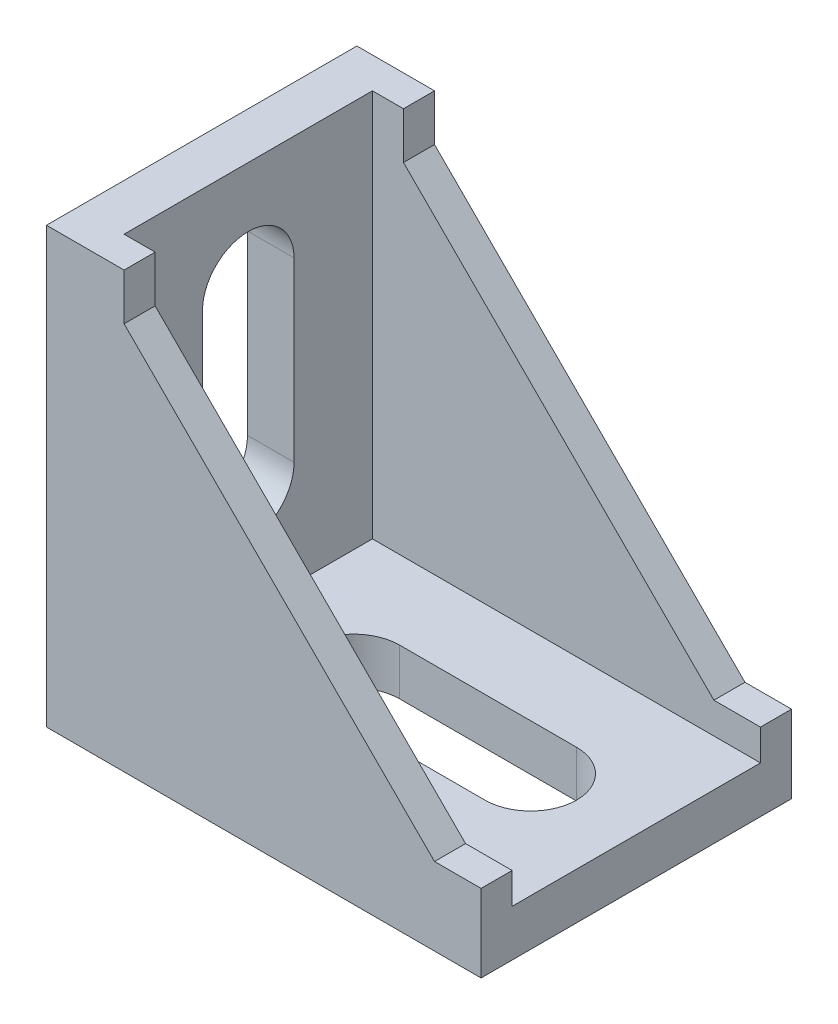
ISO-10303-21;
HEADER;
FILE_DESCRIPTION(('STEP AP214'),'2;1');
FILE_NAME('part.step','',(''),(''),'','','');
FILE_SCHEMA(('AUTOMOTIVE_DESIGN { 1 0 10303 214 1 1 1 1 }'));
ENDSEC;
DATA;
#1=APPLICATION_CONTEXT('core data for automotive mechanical design processes');
#2=APPLICATION_PROTOCOL_DEFINITION('international standard','automotive_design',2000,#1);
#3=PRODUCT_CONTEXT('',#1,'mechanical');
#4=PRODUCT('Part','Part','',(#3));
#5=PRODUCT_RELATED_PRODUCT_CATEGORY('part','',(#4));
#6=PRODUCT_DEFINITION_FORMATION('','',#4);
#7=PRODUCT_DEFINITION_CONTEXT('part definition',#1,'design');
#8=PRODUCT_DEFINITION('design','',#6,#7);
#9=PRODUCT_DEFINITION_SHAPE('','',#8);
#10=(LENGTH_UNIT() NAMED_UNIT(*) SI_UNIT(.MILLI.,.METRE.));
#11=(NAMED_UNIT(*) PLANE_ANGLE_UNIT() SI_UNIT($,.RADIAN.));
#12=(NAMED_UNIT(*) SI_UNIT($,.STERADIAN.) SOLID_ANGLE_UNIT());
#13=UNCERTAINTY_MEASURE_WITH_UNIT(LENGTH_MEASURE(1.E-05),#10,'distance_accuracy_value','');
#14=(GEOMETRIC_REPRESENTATION_CONTEXT(3) GLOBAL_UNCERTAINTY_ASSIGNED_CONTEXT((#13)) GLOBAL_UNIT_ASSIGNED_CONTEXT((#10,
#11,#12)) REPRESENTATION_CONTEXT('',''));
#15=CARTESIAN_POINT('',(0.,0.,0.));
#16=DIRECTION('',(0.,0.,1.));
#17=DIRECTION('',(1.,0.,0.));
#18=AXIS2_PLACEMENT_3D('',#15,#16,#17);
#19=CARTESIAN_POINT('',(3.,28.,-20.));
#20=DIRECTION('',(1.,0.,0.));
#21=DIRECTION('',(0.,1.,0.));
#22=AXIS2_PLACEMENT_3D('',#19,#20,#21);
#23=PLANE('',#22);
#24=CARTESIAN_POINT('',(3.,21.2,-10.));
#25=DIRECTION('',(1.,0.,0.));
#26=DIRECTION('',(0.,1.,0.));
#27=AXIS2_PLACEMENT_3D('',#24,#25,#26);
#28=CIRCLE('',#27,2.95);
#29=CARTESIAN_POINT('',(3.,21.2,-12.95));
#30=VERTEX_POINT('',#29);
#31=CARTESIAN_POINT('',(3.,21.2,-7.05));
#32=VERTEX_POINT('',#31);
#33=EDGE_CURVE('E271',#30,#32,#28,.T.);
#34=ORIENTED_EDGE('',*,*,#33,.F.);
#35=DIRECTION('',(0.,1.,0.));
#36=VECTOR('',#35,1.);
#37=CARTESIAN_POINT('',(3.,21.2,-12.95));
#38=LINE('',#37,#36);
#39=CARTESIAN_POINT('',(3.,9.8,-12.95));
#40=VERTEX_POINT('',#39);
#41=EDGE_CURVE('E285',#40,#30,#38,.T.);
#42=ORIENTED_EDGE('',*,*,#41,.F.);
#43=CARTESIAN_POINT('',(3.,9.8,-10.));
#44=DIRECTION('',(1.,0.,0.));
#45=DIRECTION('',(0.,1.,0.));
#46=AXIS2_PLACEMENT_3D('',#43,#44,#45);
#47=CIRCLE('',#46,2.95);
#48=CARTESIAN_POINT('',(3.,9.8,-7.05));
#49=VERTEX_POINT('',#48);
#50=EDGE_CURVE('E282',#49,#40,#47,.T.);
#51=ORIENTED_EDGE('',*,*,#50,.F.);
#52=DIRECTION('',(0.,-1.,0.));
#53=VECTOR('',#52,1.);
#54=CARTESIAN_POINT('',(3.,21.2,-7.05));
#55=LINE('',#54,#53);
#56=EDGE_CURVE('E279',#32,#49,#55,.T.);
#57=ORIENTED_EDGE('',*,*,#56,.F.);
#58=EDGE_LOOP('',(#34,#42,#51,#57));
#59=FACE_BOUND('',#58,.T.);
#60=DIRECTION('',(0.,0.,1.));
#61=VECTOR('',#60,1.);
#62=CARTESIAN_POINT('',(3.,3.,-20.));
#63=LINE('',#62,#61);
#64=CARTESIAN_POINT('',(3.,3.,-18.));
#65=VERTEX_POINT('',#64);
#66=CARTESIAN_POINT('',(3.,3.,-2.));
#67=VERTEX_POINT('',#66);
#68=EDGE_CURVE('E358',#65,#67,#63,.T.);
#69=ORIENTED_EDGE('',*,*,#68,.F.);
#70=DIRECTION('',(0.,-1.,0.));
#71=VECTOR('',#70,1.);
#72=CARTESIAN_POINT('',(3.,28.,-18.));
#73=LINE('',#72,#71);
#74=CARTESIAN_POINT('',(3.,28.,-18.));
#75=VERTEX_POINT('',#74);
#76=EDGE_CURVE('E67',#75,#65,#73,.T.);
#77=ORIENTED_EDGE('',*,*,#76,.F.);
#78=DIRECTION('',(0.,0.,1.));
#79=VECTOR('',#78,1.);
#80=CARTESIAN_POINT('',(3.,28.,-20.));
#81=LINE('',#80,#79);
#82=CARTESIAN_POINT('',(3.,28.,-2.));
#83=VERTEX_POINT('',#82);
#84=EDGE_CURVE('E216',#75,#83,#81,.T.);
#85=ORIENTED_EDGE('',*,*,#84,.T.);
#86=DIRECTION('',(0.,-1.,0.));
#87=VECTOR('',#86,1.);
#88=CARTESIAN_POINT('',(3.,28.,-2.));
#89=LINE('',#88,#87);
#90=EDGE_CURVE('E239',#83,#67,#89,.T.);
#91=ORIENTED_EDGE('',*,*,#90,.T.);
#92=EDGE_LOOP('',(#69,#77,#85,#91));
#93=FACE_BOUND('',#92,.T.);
#94=ADVANCED_FACE('F43',(#59,#93),#23,.T.);
#95=CARTESIAN_POINT('',(3.,3.,-20.));
#96=DIRECTION('',(0.,1.,0.));
#97=DIRECTION('',(-1.,0.,0.));
#98=AXIS2_PLACEMENT_3D('',#95,#96,#97);
#99=PLANE('',#98);
#100=CARTESIAN_POINT('',(9.8,3.,-10.));
#101=DIRECTION('',(0.,1.,0.));
#102=DIRECTION('',(-1.,0.,0.));
#103=AXIS2_PLACEMENT_3D('',#100,#101,#102);
#104=CIRCLE('',#103,2.95);
#105=CARTESIAN_POINT('',(9.8,3.,-12.95));
#106=VERTEX_POINT('',#105);
#107=CARTESIAN_POINT('',(9.8,3.,-7.05));
#108=VERTEX_POINT('',#107);
#109=EDGE_CURVE('E306',#106,#108,#104,.T.);
#110=ORIENTED_EDGE('',*,*,#109,.F.);
#111=DIRECTION('',(-1.,0.,0.));
#112=VECTOR('',#111,1.);
#113=CARTESIAN_POINT('',(9.8,3.,-12.95));
#114=LINE('',#113,#112);
#115=CARTESIAN_POINT('',(21.2,3.,-12.95));
#116=VERTEX_POINT('',#115);
#117=EDGE_CURVE('E314',#116,#106,#114,.T.);
#118=ORIENTED_EDGE('',*,*,#117,.F.);
#119=CARTESIAN_POINT('',(21.2,3.,-10.));
#120=DIRECTION('',(0.,1.,0.));
#121=DIRECTION('',(-1.,0.,0.));
#122=AXIS2_PLACEMENT_3D('',#119,#120,#121);
#123=CIRCLE('',#122,2.95);
#124=CARTESIAN_POINT('',(21.2,3.,-7.05));
#125=VERTEX_POINT('',#124);
#126=EDGE_CURVE('E311',#125,#116,#123,.T.);
#127=ORIENTED_EDGE('',*,*,#126,.F.);
#128=DIRECTION('',(1.,0.,0.));
#129=VECTOR('',#128,1.);
#130=CARTESIAN_POINT('',(9.8,3.,-7.05));
#131=LINE('',#130,#129);
#132=EDGE_CURVE('E308',#108,#125,#131,.T.);
#133=ORIENTED_EDGE('',*,*,#132,.F.);
#134=EDGE_LOOP('',(#110,#118,#127,#133));
#135=FACE_BOUND('',#134,.T.);
#136=DIRECTION('',(0.,0.,1.));
#137=VECTOR('',#136,1.);
#138=CARTESIAN_POINT('',(28.,3.,-20.));
#139=LINE('',#138,#137);
#140=CARTESIAN_POINT('',(28.,3.,-18.));
#141=VERTEX_POINT('',#140);
#142=CARTESIAN_POINT('',(28.,3.,-2.));
#143=VERTEX_POINT('',#142);
#144=EDGE_CURVE('E359',#141,#143,#139,.T.);
#145=ORIENTED_EDGE('',*,*,#144,.F.);
#146=DIRECTION('',(1.,0.,0.));
#147=VECTOR('',#146,1.);
#148=CARTESIAN_POINT('',(3.,3.,-18.));
#149=LINE('',#148,#147);
#150=EDGE_CURVE('E60',#65,#141,#149,.T.);
#151=ORIENTED_EDGE('',*,*,#150,.F.);
#152=ORIENTED_EDGE('',*,*,#68,.T.);
#153=DIRECTION('',(1.,0.,0.));
#154=VECTOR('',#153,1.);
#155=CARTESIAN_POINT('',(3.,3.,-2.));
#156=LINE('',#155,#154);
#157=EDGE_CURVE('E242',#67,#143,#156,.T.);
#158=ORIENTED_EDGE('',*,*,#157,.T.);
#159=EDGE_LOOP('',(#145,#151,#152,#158));
#160=FACE_BOUND('',#159,.T.);
#161=ADVANCED_FACE('F401',(#135,#160),#99,.T.);
#162=CARTESIAN_POINT('',(28.,0.,-20.));
#163=DIRECTION('',(0.,-1.,0.));
#164=DIRECTION('',(1.,0.,0.));
#165=AXIS2_PLACEMENT_3D('',#162,#163,#164);
#166=PLANE('',#165);
#167=CARTESIAN_POINT('',(9.8,0.,-10.));
#168=DIRECTION('',(0.,-1.,0.));
#169=DIRECTION('',(1.,0.,0.));
#170=AXIS2_PLACEMENT_3D('',#167,#168,#169);
#171=CIRCLE('',#170,2.95);
#172=CARTESIAN_POINT('',(9.8,0.,-7.05));
#173=VERTEX_POINT('',#172);
#174=CARTESIAN_POINT('',(9.8,0.,-12.95));
#175=VERTEX_POINT('',#174);
#176=EDGE_CURVE('E333',#173,#175,#171,.T.);
#177=ORIENTED_EDGE('',*,*,#176,.F.);
#178=DIRECTION('',(-1.,0.,0.));
#179=VECTOR('',#178,1.);
#180=CARTESIAN_POINT('',(28.,0.,-7.05000000000001));
#181=LINE('',#180,#179);
#182=CARTESIAN_POINT('',(21.2,0.,-7.05000000000001));
#183=VERTEX_POINT('',#182);
#184=EDGE_CURVE('E320',#183,#173,#181,.T.);
#185=ORIENTED_EDGE('',*,*,#184,.F.);
#186=CARTESIAN_POINT('',(21.2,0.,-10.));
#187=DIRECTION('',(0.,-1.,0.));
#188=DIRECTION('',(1.,0.,0.));
#189=AXIS2_PLACEMENT_3D('',#186,#187,#188);
#190=CIRCLE('',#189,2.95);
#191=CARTESIAN_POINT('',(21.2,0.,-12.95));
#192=VERTEX_POINT('',#191);
#193=EDGE_CURVE('E328',#192,#183,#190,.T.);
#194=ORIENTED_EDGE('',*,*,#193,.F.);
#195=DIRECTION('',(1.,0.,0.));
#196=VECTOR('',#195,1.);
#197=CARTESIAN_POINT('',(28.,0.,-12.95));
#198=LINE('',#197,#196);
#199=EDGE_CURVE('E331',#175,#192,#198,.T.);
#200=ORIENTED_EDGE('',*,*,#199,.F.);
#201=EDGE_LOOP('',(#177,#185,#194,#200));
#202=FACE_BOUND('',#201,.T.);
#203=DIRECTION('',(1.,0.,0.));
#204=VECTOR('',#203,1.);
#205=CARTESIAN_POINT('',(28.,0.,0.));
#206=LINE('',#205,#204);
#207=CARTESIAN_POINT('',(0.,0.,0.));
#208=VERTEX_POINT('',#207);
#209=CARTESIAN_POINT('',(28.,0.,0.));
#210=VERTEX_POINT('',#209);
#211=EDGE_CURVE('E335',#208,#210,#206,.T.);
#212=ORIENTED_EDGE('',*,*,#211,.F.);
#213=DIRECTION('',(0.,0.,1.));
#214=VECTOR('',#213,1.);
#215=CARTESIAN_POINT('',(0.,0.,-20.));
#216=LINE('',#215,#214);
#217=CARTESIAN_POINT('',(0.,0.,-20.));
#218=VERTEX_POINT('',#217);
#219=EDGE_CURVE('E11',#218,#208,#216,.T.);
#220=ORIENTED_EDGE('',*,*,#219,.F.);
#221=DIRECTION('',(1.,0.,0.));
#222=VECTOR('',#221,1.);
#223=CARTESIAN_POINT('',(28.,0.,-20.));
#224=LINE('',#223,#222);
#225=CARTESIAN_POINT('',(28.,0.,-20.));
#226=VERTEX_POINT('',#225);
#227=EDGE_CURVE('E336',#218,#226,#224,.T.);
#228=ORIENTED_EDGE('',*,*,#227,.T.);
#229=DIRECTION('',(0.,0.,1.));
#230=VECTOR('',#229,1.);
#231=CARTESIAN_POINT('',(28.,0.,-20.));
#232=LINE('',#231,#230);
#233=EDGE_CURVE('E47',#226,#210,#232,.T.);
#234=ORIENTED_EDGE('',*,*,#233,.T.);
#235=EDGE_LOOP('',(#212,#220,#228,#234));
#236=FACE_BOUND('',#235,.T.);
#237=ADVANCED_FACE('F45',(#202,#236),#166,.T.);
#238=CARTESIAN_POINT('',(0.,0.,-20.));
#239=DIRECTION('',(-1.,0.,0.));
#240=DIRECTION('',(0.,0.,1.));
#241=AXIS2_PLACEMENT_3D('',#238,#239,#240);
#242=PLANE('',#241);
#243=CARTESIAN_POINT('',(0.,21.2,-10.));
#244=DIRECTION('',(-1.,0.,0.));
#245=DIRECTION('',(0.,0.,1.));
#246=AXIS2_PLACEMENT_3D('',#243,#244,#245);
#247=CIRCLE('',#246,2.95);
#248=CARTESIAN_POINT('',(0.,21.2,-7.05));
#249=VERTEX_POINT('',#248);
#250=CARTESIAN_POINT('',(0.,21.2,-12.95));
#251=VERTEX_POINT('',#250);
#252=EDGE_CURVE('E304',#249,#251,#247,.T.);
#253=ORIENTED_EDGE('',*,*,#252,.F.);
#254=DIRECTION('',(0.,1.,0.));
#255=VECTOR('',#254,1.);
#256=CARTESIAN_POINT('',(0.,0.,-7.05));
#257=LINE('',#256,#255);
#258=CARTESIAN_POINT('',(0.,9.8,-7.05));
#259=VERTEX_POINT('',#258);
#260=EDGE_CURVE('E291',#259,#249,#257,.T.);
#261=ORIENTED_EDGE('',*,*,#260,.F.);
#262=CARTESIAN_POINT('',(0.,9.8,-10.));
#263=DIRECTION('',(-1.,0.,0.));
#264=DIRECTION('',(0.,0.,1.));
#265=AXIS2_PLACEMENT_3D('',#262,#263,#264);
#266=CIRCLE('',#265,2.95);
#267=CARTESIAN_POINT('',(0.,9.8,-12.95));
#268=VERTEX_POINT('',#267);
#269=EDGE_CURVE('E299',#268,#259,#266,.T.);
#270=ORIENTED_EDGE('',*,*,#269,.F.);
#271=DIRECTION('',(0.,-1.,0.));
#272=VECTOR('',#271,1.);
#273=CARTESIAN_POINT('',(0.,0.,-12.95));
#274=LINE('',#273,#272);
#275=EDGE_CURVE('E302',#251,#268,#274,.T.);
#276=ORIENTED_EDGE('',*,*,#275,.F.);
#277=EDGE_LOOP('',(#253,#261,#270,#276));
#278=FACE_BOUND('',#277,.T.);
#279=DIRECTION('',(0.,-1.,0.));
#280=VECTOR('',#279,1.);
#281=CARTESIAN_POINT('',(0.,0.,0.));
#282=LINE('',#281,#280);
#283=CARTESIAN_POINT('',(0.,28.,0.));
#284=VERTEX_POINT('',#283);
#285=EDGE_CURVE('E340',#284,#208,#282,.T.);
#286=ORIENTED_EDGE('',*,*,#285,.F.);
#287=DIRECTION('',(0.,0.,1.));
#288=VECTOR('',#287,1.);
#289=CARTESIAN_POINT('',(0.,28.,-20.));
#290=LINE('',#289,#288);
#291=CARTESIAN_POINT('',(0.,28.,-20.));
#292=VERTEX_POINT('',#291);
#293=EDGE_CURVE('E52',#292,#284,#290,.T.);
#294=ORIENTED_EDGE('',*,*,#293,.F.);
#295=DIRECTION('',(0.,-1.,0.));
#296=VECTOR('',#295,1.);
#297=CARTESIAN_POINT('',(0.,0.,-20.));
#298=LINE('',#297,#296);
#299=EDGE_CURVE('E344',#292,#218,#298,.T.);
#300=ORIENTED_EDGE('',*,*,#299,.T.);
#301=ORIENTED_EDGE('',*,*,#219,.T.);
#302=EDGE_LOOP('',(#286,#294,#300,#301));
#303=FACE_BOUND('',#302,.T.);
#304=ADVANCED_FACE('F374',(#278,#303),#242,.T.);
#305=CARTESIAN_POINT('',(0.,28.,-20.));
#306=DIRECTION('',(0.,1.,0.));
#307=DIRECTION('',(0.,0.,1.));
#308=AXIS2_PLACEMENT_3D('',#305,#306,#307);
#309=PLANE('',#308);
#310=DIRECTION('',(-1.,0.,0.));
#311=VECTOR('',#310,1.);
#312=CARTESIAN_POINT('',(0.,28.,0.));
#313=LINE('',#312,#311);
#314=CARTESIAN_POINT('',(5.,28.,0.));
#315=VERTEX_POINT('',#314);
#316=EDGE_CURVE('E351',#315,#284,#313,.T.);
#317=ORIENTED_EDGE('',*,*,#316,.F.);
#318=DIRECTION('',(0.,0.,1.));
#319=VECTOR('',#318,1.);
#320=CARTESIAN_POINT('',(5.,28.,-2.));
#321=LINE('',#320,#319);
#322=CARTESIAN_POINT('',(5.,28.,-2.));
#323=VERTEX_POINT('',#322);
#324=EDGE_CURVE('E268',#323,#315,#321,.T.);
#325=ORIENTED_EDGE('',*,*,#324,.F.);
#326=DIRECTION('',(-1.,0.,0.));
#327=VECTOR('',#326,1.);
#328=CARTESIAN_POINT('',(3.,28.,-2.));
#329=LINE('',#328,#327);
#330=EDGE_CURVE('E258',#323,#83,#329,.T.);
#331=ORIENTED_EDGE('',*,*,#330,.T.);
#332=ORIENTED_EDGE('',*,*,#84,.F.);
#333=DIRECTION('',(-1.,0.,0.));
#334=VECTOR('',#333,1.);
#335=CARTESIAN_POINT('',(3.,28.,-18.));
#336=LINE('',#335,#334);
#337=CARTESIAN_POINT('',(5.,28.,-18.));
#338=VERTEX_POINT('',#337);
#339=EDGE_CURVE('E197',#338,#75,#336,.T.);
#340=ORIENTED_EDGE('',*,*,#339,.F.);
#341=DIRECTION('',(0.,0.,-1.));
#342=VECTOR('',#341,1.);
#343=CARTESIAN_POINT('',(5.,28.,-18.));
#344=LINE('',#343,#342);
#345=CARTESIAN_POINT('',(5.,28.,-20.));
#346=VERTEX_POINT('',#345);
#347=EDGE_CURVE('E206',#338,#346,#344,.T.);
#348=ORIENTED_EDGE('',*,*,#347,.T.);
#349=DIRECTION('',(-1.,0.,0.));
#350=VECTOR('',#349,1.);
#351=CARTESIAN_POINT('',(0.,28.,-20.));
#352=LINE('',#351,#350);
#353=EDGE_CURVE('E342',#346,#292,#352,.T.);
#354=ORIENTED_EDGE('',*,*,#353,.T.);
#355=ORIENTED_EDGE('',*,*,#293,.T.);
#356=EDGE_LOOP('',(#317,#325,#331,#332,#340,#348,#354,#355));
#357=FACE_BOUND('',#356,.T.);
#358=ADVANCED_FACE('F214',(#357),#309,.T.);
#359=CARTESIAN_POINT('',(28.,3.,-20.));
#360=DIRECTION('',(1.,0.,0.));
#361=DIRECTION('',(0.,0.,-1.));
#362=AXIS2_PLACEMENT_3D('',#359,#360,#361);
#363=PLANE('',#362);
#364=DIRECTION('',(0.,1.,0.));
#365=VECTOR('',#364,1.);
#366=CARTESIAN_POINT('',(28.,3.,0.));
#367=LINE('',#366,#365);
#368=CARTESIAN_POINT('',(28.,5.,0.));
#369=VERTEX_POINT('',#368);
#370=EDGE_CURVE('E349',#210,#369,#367,.T.);
#371=ORIENTED_EDGE('',*,*,#370,.F.);
#372=ORIENTED_EDGE('',*,*,#233,.F.);
#373=DIRECTION('',(0.,1.,0.));
#374=VECTOR('',#373,1.);
#375=CARTESIAN_POINT('',(28.,3.,-20.));
#376=LINE('',#375,#374);
#377=CARTESIAN_POINT('',(28.,5.,-20.));
#378=VERTEX_POINT('',#377);
#379=EDGE_CURVE('E339',#226,#378,#376,.T.);
#380=ORIENTED_EDGE('',*,*,#379,.T.);
#381=DIRECTION('',(0.,0.,-1.));
#382=VECTOR('',#381,1.);
#383=CARTESIAN_POINT('',(28.,5.,-18.));
#384=LINE('',#383,#382);
#385=CARTESIAN_POINT('',(28.,5.,-18.));
#386=VERTEX_POINT('',#385);
#387=EDGE_CURVE('E231',#386,#378,#384,.T.);
#388=ORIENTED_EDGE('',*,*,#387,.F.);
#389=DIRECTION('',(0.,1.,0.));
#390=VECTOR('',#389,1.);
#391=CARTESIAN_POINT('',(28.,5.,-18.));
#392=LINE('',#391,#390);
#393=EDGE_CURVE('E224',#141,#386,#392,.T.);
#394=ORIENTED_EDGE('',*,*,#393,.F.);
#395=ORIENTED_EDGE('',*,*,#144,.T.);
#396=DIRECTION('',(0.,1.,0.));
#397=VECTOR('',#396,1.);
#398=CARTESIAN_POINT('',(28.,5.,-2.));
#399=LINE('',#398,#397);
#400=CARTESIAN_POINT('',(28.,5.,-2.));
#401=VERTEX_POINT('',#400);
#402=EDGE_CURVE('E246',#143,#401,#399,.T.);
#403=ORIENTED_EDGE('',*,*,#402,.T.);
#404=DIRECTION('',(0.,0.,1.));
#405=VECTOR('',#404,1.);
#406=CARTESIAN_POINT('',(28.,5.,-2.));
#407=LINE('',#406,#405);
#408=EDGE_CURVE('E260',#401,#369,#407,.T.);
#409=ORIENTED_EDGE('',*,*,#408,.T.);
#410=EDGE_LOOP('',(#371,#372,#380,#388,#394,#395,#403,#409));
#411=FACE_BOUND('',#410,.T.);
#412=ADVANCED_FACE('F368',(#411),#363,.T.);
#413=CARTESIAN_POINT('',(0.,0.,-20.));
#414=DIRECTION('',(0.,0.,-1.));
#415=DIRECTION('',(-1.,0.,0.));
#416=AXIS2_PLACEMENT_3D('',#413,#414,#415);
#417=PLANE('',#416);
#418=ORIENTED_EDGE('',*,*,#353,.F.);
#419=DIRECTION('',(0.,1.,0.));
#420=VECTOR('',#419,1.);
#421=CARTESIAN_POINT('',(5.,28.,-20.));
#422=LINE('',#421,#420);
#423=CARTESIAN_POINT('',(5.,24.9999999999999,-20.));
#424=VERTEX_POINT('',#423);
#425=EDGE_CURVE('E209',#424,#346,#422,.T.);
#426=ORIENTED_EDGE('',*,*,#425,.F.);
#427=DIRECTION('',(-0.707106781186549,0.707106781186546,0.));
#428=VECTOR('',#427,1.);
#429=CARTESIAN_POINT('',(5.,24.9999999999999,-20.));
#430=LINE('',#429,#428);
#431=CARTESIAN_POINT('',(25.,5.,-20.));
#432=VERTEX_POINT('',#431);
#433=EDGE_CURVE('E228',#432,#424,#430,.T.);
#434=ORIENTED_EDGE('',*,*,#433,.F.);
#435=DIRECTION('',(-1.,0.,0.));
#436=VECTOR('',#435,1.);
#437=CARTESIAN_POINT('',(25.,5.,-20.));
#438=LINE('',#437,#436);
#439=EDGE_CURVE('E218',#378,#432,#438,.T.);
#440=ORIENTED_EDGE('',*,*,#439,.F.);
#441=ORIENTED_EDGE('',*,*,#379,.F.);
#442=ORIENTED_EDGE('',*,*,#227,.F.);
#443=ORIENTED_EDGE('',*,*,#299,.F.);
#444=EDGE_LOOP('',(#418,#426,#434,#440,#441,#442,#443));
#445=FACE_BOUND('',#444,.T.);
#446=ADVANCED_FACE('F377',(#445),#417,.T.);
#447=CARTESIAN_POINT('',(0.,0.,0.));
#448=DIRECTION('',(0.,0.,-1.));
#449=DIRECTION('',(-1.,0.,0.));
#450=AXIS2_PLACEMENT_3D('',#447,#448,#449);
#451=PLANE('',#450);
#452=DIRECTION('',(0.,1.,0.));
#453=VECTOR('',#452,1.);
#454=CARTESIAN_POINT('',(5.,28.,0.));
#455=LINE('',#454,#453);
#456=CARTESIAN_POINT('',(5.,24.9999999999999,0.));
#457=VERTEX_POINT('',#456);
#458=EDGE_CURVE('E243',#457,#315,#455,.T.);
#459=ORIENTED_EDGE('',*,*,#458,.T.);
#460=ORIENTED_EDGE('',*,*,#316,.T.);
#461=ORIENTED_EDGE('',*,*,#285,.T.);
#462=ORIENTED_EDGE('',*,*,#211,.T.);
#463=ORIENTED_EDGE('',*,*,#370,.T.);
#464=DIRECTION('',(-1.,0.,0.));
#465=VECTOR('',#464,1.);
#466=CARTESIAN_POINT('',(25.,5.,0.));
#467=LINE('',#466,#465);
#468=CARTESIAN_POINT('',(25.,5.,0.));
#469=VERTEX_POINT('',#468);
#470=EDGE_CURVE('E234',#369,#469,#467,.T.);
#471=ORIENTED_EDGE('',*,*,#470,.T.);
#472=DIRECTION('',(-0.707106781186549,0.707106781186546,0.));
#473=VECTOR('',#472,1.);
#474=CARTESIAN_POINT('',(5.,24.9999999999999,0.));
#475=LINE('',#474,#473);
#476=EDGE_CURVE('E263',#469,#457,#475,.T.);
#477=ORIENTED_EDGE('',*,*,#476,.T.);
#478=EDGE_LOOP('',(#459,#460,#461,#462,#463,#471,#477));
#479=FACE_BOUND('',#478,.T.);
#480=ADVANCED_FACE('F371',(#479),#451,.F.);
#481=CARTESIAN_POINT('',(9.8,-7.,-10.));
#482=DIRECTION('',(0.,1.,0.));
#483=DIRECTION('',(-1.,0.,0.));
#484=AXIS2_PLACEMENT_3D('',#481,#482,#483);
#485=CYLINDRICAL_SURFACE('',#484,2.95);
#486=ORIENTED_EDGE('',*,*,#176,.T.);
#487=DIRECTION('',(0.,1.,0.));
#488=VECTOR('',#487,1.);
#489=CARTESIAN_POINT('',(9.8,-7.,-12.95));
#490=LINE('',#489,#488);
#491=EDGE_CURVE('E318',#175,#106,#490,.T.);
#492=ORIENTED_EDGE('',*,*,#491,.T.);
#493=ORIENTED_EDGE('',*,*,#109,.T.);
#494=DIRECTION('',(0.,1.,0.));
#495=VECTOR('',#494,1.);
#496=CARTESIAN_POINT('',(9.8,-7.,-7.05));
#497=LINE('',#496,#495);
#498=EDGE_CURVE('E317',#173,#108,#497,.T.);
#499=ORIENTED_EDGE('',*,*,#498,.F.);
#500=EDGE_LOOP('',(#486,#492,#493,#499));
#501=FACE_BOUND('',#500,.T.);
#502=ADVANCED_FACE('F427',(#501),#485,.F.);
#503=CARTESIAN_POINT('',(9.8,-7.,-12.95));
#504=DIRECTION('',(0.,0.,-1.));
#505=DIRECTION('',(-1.,0.,0.));
#506=AXIS2_PLACEMENT_3D('',#503,#504,#505);
#507=PLANE('',#506);
#508=ORIENTED_EDGE('',*,*,#199,.T.);
#509=DIRECTION('',(0.,1.,0.));
#510=VECTOR('',#509,1.);
#511=CARTESIAN_POINT('',(21.2,-7.,-12.95));
#512=LINE('',#511,#510);
#513=EDGE_CURVE('E321',#192,#116,#512,.T.);
#514=ORIENTED_EDGE('',*,*,#513,.T.);
#515=ORIENTED_EDGE('',*,*,#117,.T.);
#516=ORIENTED_EDGE('',*,*,#491,.F.);
#517=EDGE_LOOP('',(#508,#514,#515,#516));
#518=FACE_BOUND('',#517,.T.);
#519=ADVANCED_FACE('F431',(#518),#507,.F.);
#520=CARTESIAN_POINT('',(21.2,-7.,-10.));
#521=DIRECTION('',(0.,1.,0.));
#522=DIRECTION('',(-1.,0.,0.));
#523=AXIS2_PLACEMENT_3D('',#520,#521,#522);
#524=CYLINDRICAL_SURFACE('',#523,2.95);
#525=ORIENTED_EDGE('',*,*,#193,.T.);
#526=DIRECTION('',(0.,1.,0.));
#527=VECTOR('',#526,1.);
#528=CARTESIAN_POINT('',(21.2,-7.,-7.05));
#529=LINE('',#528,#527);
#530=EDGE_CURVE('E323',#183,#125,#529,.T.);
#531=ORIENTED_EDGE('',*,*,#530,.T.);
#532=ORIENTED_EDGE('',*,*,#126,.T.);
#533=ORIENTED_EDGE('',*,*,#513,.F.);
#534=EDGE_LOOP('',(#525,#531,#532,#533));
#535=FACE_BOUND('',#534,.T.);
#536=ADVANCED_FACE('F437',(#535),#524,.F.);
#537=CARTESIAN_POINT('',(9.8,-7.,-7.05));
#538=DIRECTION('',(0.,0.,1.));
#539=DIRECTION('',(1.,0.,0.));
#540=AXIS2_PLACEMENT_3D('',#537,#538,#539);
#541=PLANE('',#540);
#542=ORIENTED_EDGE('',*,*,#184,.T.);
#543=ORIENTED_EDGE('',*,*,#498,.T.);
#544=ORIENTED_EDGE('',*,*,#132,.T.);
#545=ORIENTED_EDGE('',*,*,#530,.F.);
#546=EDGE_LOOP('',(#542,#543,#544,#545));
#547=FACE_BOUND('',#546,.T.);
#548=ADVANCED_FACE('F433',(#547),#541,.F.);
#549=CARTESIAN_POINT('',(-7.,21.2,-10.));
#550=DIRECTION('',(1.,0.,0.));
#551=DIRECTION('',(0.,1.,0.));
#552=AXIS2_PLACEMENT_3D('',#549,#550,#551);
#553=CYLINDRICAL_SURFACE('',#552,2.95);
#554=ORIENTED_EDGE('',*,*,#252,.T.);
#555=DIRECTION('',(1.,0.,0.));
#556=VECTOR('',#555,1.);
#557=CARTESIAN_POINT('',(-7.,21.2,-12.95));
#558=LINE('',#557,#556);
#559=EDGE_CURVE('E289',#251,#30,#558,.T.);
#560=ORIENTED_EDGE('',*,*,#559,.T.);
#561=ORIENTED_EDGE('',*,*,#33,.T.);
#562=DIRECTION('',(1.,0.,0.));
#563=VECTOR('',#562,1.);
#564=CARTESIAN_POINT('',(-7.,21.2,-7.05));
#565=LINE('',#564,#563);
#566=EDGE_CURVE('E288',#249,#32,#565,.T.);
#567=ORIENTED_EDGE('',*,*,#566,.F.);
#568=EDGE_LOOP('',(#554,#560,#561,#567));
#569=FACE_BOUND('',#568,.T.);
#570=ADVANCED_FACE('F436',(#569),#553,.F.);
#571=CARTESIAN_POINT('',(-7.,21.2,-12.95));
#572=DIRECTION('',(0.,0.,-1.));
#573=DIRECTION('',(-1.,0.,0.));
#574=AXIS2_PLACEMENT_3D('',#571,#572,#573);
#575=PLANE('',#574);
#576=ORIENTED_EDGE('',*,*,#275,.T.);
#577=DIRECTION('',(1.,0.,0.));
#578=VECTOR('',#577,1.);
#579=CARTESIAN_POINT('',(-7.,9.8,-12.95));
#580=LINE('',#579,#578);
#581=EDGE_CURVE('E292',#268,#40,#580,.T.);
#582=ORIENTED_EDGE('',*,*,#581,.T.);
#583=ORIENTED_EDGE('',*,*,#41,.T.);
#584=ORIENTED_EDGE('',*,*,#559,.F.);
#585=EDGE_LOOP('',(#576,#582,#583,#584));
#586=FACE_BOUND('',#585,.T.);
#587=ADVANCED_FACE('F447',(#586),#575,.F.);
#588=CARTESIAN_POINT('',(-7.,9.8,-10.));
#589=DIRECTION('',(1.,0.,0.));
#590=DIRECTION('',(0.,1.,0.));
#591=AXIS2_PLACEMENT_3D('',#588,#589,#590);
#592=CYLINDRICAL_SURFACE('',#591,2.95);
#593=ORIENTED_EDGE('',*,*,#269,.T.);
#594=DIRECTION('',(1.,0.,0.));
#595=VECTOR('',#594,1.);
#596=CARTESIAN_POINT('',(-7.,9.8,-7.05));
#597=LINE('',#596,#595);
#598=EDGE_CURVE('E294',#259,#49,#597,.T.);
#599=ORIENTED_EDGE('',*,*,#598,.T.);
#600=ORIENTED_EDGE('',*,*,#50,.T.);
#601=ORIENTED_EDGE('',*,*,#581,.F.);
#602=EDGE_LOOP('',(#593,#599,#600,#601));
#603=FACE_BOUND('',#602,.T.);
#604=ADVANCED_FACE('F452',(#603),#592,.F.);
#605=CARTESIAN_POINT('',(-7.,21.2,-7.05));
#606=DIRECTION('',(0.,0.,1.));
#607=DIRECTION('',(1.,0.,0.));
#608=AXIS2_PLACEMENT_3D('',#605,#606,#607);
#609=PLANE('',#608);
#610=ORIENTED_EDGE('',*,*,#260,.T.);
#611=ORIENTED_EDGE('',*,*,#566,.T.);
#612=ORIENTED_EDGE('',*,*,#56,.T.);
#613=ORIENTED_EDGE('',*,*,#598,.F.);
#614=EDGE_LOOP('',(#610,#611,#612,#613));
#615=FACE_BOUND('',#614,.T.);
#616=ADVANCED_FACE('F449',(#615),#609,.F.);
#617=CARTESIAN_POINT('',(5.,28.,-2.));
#618=DIRECTION('',(1.,0.,0.));
#619=DIRECTION('',(0.,0.,-1.));
#620=AXIS2_PLACEMENT_3D('',#617,#618,#619);
#621=PLANE('',#620);
#622=ORIENTED_EDGE('',*,*,#458,.F.);
#623=DIRECTION('',(0.,0.,1.));
#624=VECTOR('',#623,1.);
#625=CARTESIAN_POINT('',(5.,24.9999999999999,-2.));
#626=LINE('',#625,#624);
#627=CARTESIAN_POINT('',(5.,24.9999999999999,-2.));
#628=VERTEX_POINT('',#627);
#629=EDGE_CURVE('E272',#628,#457,#626,.T.);
#630=ORIENTED_EDGE('',*,*,#629,.F.);
#631=DIRECTION('',(0.,1.,0.));
#632=VECTOR('',#631,1.);
#633=CARTESIAN_POINT('',(5.,28.,-2.));
#634=LINE('',#633,#632);
#635=EDGE_CURVE('E255',#628,#323,#634,.T.);
#636=ORIENTED_EDGE('',*,*,#635,.T.);
#637=ORIENTED_EDGE('',*,*,#324,.T.);
#638=EDGE_LOOP('',(#622,#630,#636,#637));
#639=FACE_BOUND('',#638,.T.);
#640=ADVANCED_FACE('F389',(#639),#621,.T.);
#641=CARTESIAN_POINT('',(5.,24.9999999999999,-2.));
#642=DIRECTION('',(0.707106781186546,0.707106781186549,0.));
#643=DIRECTION('',(-0.707106781186549,0.707106781186546,0.));
#644=AXIS2_PLACEMENT_3D('',#641,#642,#643);
#645=PLANE('',#644);
#646=ORIENTED_EDGE('',*,*,#476,.F.);
#647=DIRECTION('',(0.,0.,1.));
#648=VECTOR('',#647,1.);
#649=CARTESIAN_POINT('',(25.,5.,-2.));
#650=LINE('',#649,#648);
#651=CARTESIAN_POINT('',(25.,5.,-2.));
#652=VERTEX_POINT('',#651);
#653=EDGE_CURVE('E274',#652,#469,#650,.T.);
#654=ORIENTED_EDGE('',*,*,#653,.F.);
#655=DIRECTION('',(-0.707106781186549,0.707106781186546,0.));
#656=VECTOR('',#655,1.);
#657=CARTESIAN_POINT('',(5.,24.9999999999999,-2.));
#658=LINE('',#657,#656);
#659=EDGE_CURVE('E252',#652,#628,#658,.T.);
#660=ORIENTED_EDGE('',*,*,#659,.T.);
#661=ORIENTED_EDGE('',*,*,#629,.T.);
#662=EDGE_LOOP('',(#646,#654,#660,#661));
#663=FACE_BOUND('',#662,.T.);
#664=ADVANCED_FACE('F394',(#663),#645,.T.);
#665=CARTESIAN_POINT('',(25.,5.,-2.));
#666=DIRECTION('',(0.,1.,0.));
#667=DIRECTION('',(0.,0.,1.));
#668=AXIS2_PLACEMENT_3D('',#665,#666,#667);
#669=PLANE('',#668);
#670=ORIENTED_EDGE('',*,*,#470,.F.);
#671=ORIENTED_EDGE('',*,*,#408,.F.);
#672=DIRECTION('',(-1.,0.,0.));
#673=VECTOR('',#672,1.);
#674=CARTESIAN_POINT('',(25.,5.,-2.));
#675=LINE('',#674,#673);
#676=EDGE_CURVE('E249',#401,#652,#675,.T.);
#677=ORIENTED_EDGE('',*,*,#676,.T.);
#678=ORIENTED_EDGE('',*,*,#653,.T.);
#679=EDGE_LOOP('',(#670,#671,#677,#678));
#680=FACE_BOUND('',#679,.T.);
#681=ADVANCED_FACE('F460',(#680),#669,.T.);
#682=CARTESIAN_POINT('',(0.,0.,-2.));
#683=DIRECTION('',(0.,0.,1.));
#684=DIRECTION('',(1.,0.,0.));
#685=AXIS2_PLACEMENT_3D('',#682,#683,#684);
#686=PLANE('',#685);
#687=ORIENTED_EDGE('',*,*,#90,.F.);
#688=ORIENTED_EDGE('',*,*,#330,.F.);
#689=ORIENTED_EDGE('',*,*,#635,.F.);
#690=ORIENTED_EDGE('',*,*,#659,.F.);
#691=ORIENTED_EDGE('',*,*,#676,.F.);
#692=ORIENTED_EDGE('',*,*,#402,.F.);
#693=ORIENTED_EDGE('',*,*,#157,.F.);
#694=EDGE_LOOP('',(#687,#688,#689,#690,#691,#692,#693));
#695=FACE_BOUND('',#694,.T.);
#696=ADVANCED_FACE('F398',(#695),#686,.F.);
#697=CARTESIAN_POINT('',(25.,5.,-18.));
#698=DIRECTION('',(0.,-1.,0.));
#699=DIRECTION('',(0.,0.,-1.));
#700=AXIS2_PLACEMENT_3D('',#697,#698,#699);
#701=PLANE('',#700);
#702=ORIENTED_EDGE('',*,*,#439,.T.);
#703=DIRECTION('',(0.,0.,-1.));
#704=VECTOR('',#703,1.);
#705=CARTESIAN_POINT('',(25.,5.,-18.));
#706=LINE('',#705,#704);
#707=CARTESIAN_POINT('',(25.,5.,-18.));
#708=VERTEX_POINT('',#707);
#709=EDGE_CURVE('E235',#708,#432,#706,.T.);
#710=ORIENTED_EDGE('',*,*,#709,.F.);
#711=DIRECTION('',(-1.,0.,0.));
#712=VECTOR('',#711,1.);
#713=CARTESIAN_POINT('',(25.,5.,-18.));
#714=LINE('',#713,#712);
#715=EDGE_CURVE('E222',#386,#708,#714,.T.);
#716=ORIENTED_EDGE('',*,*,#715,.F.);
#717=ORIENTED_EDGE('',*,*,#387,.T.);
#718=EDGE_LOOP('',(#702,#710,#716,#717));
#719=FACE_BOUND('',#718,.T.);
#720=ADVANCED_FACE('F383',(#719),#701,.F.);
#721=CARTESIAN_POINT('',(5.,24.9999999999999,-18.));
#722=DIRECTION('',(-0.707106781186546,-0.707106781186549,0.));
#723=DIRECTION('',(0.707106781186549,-0.707106781186546,0.));
#724=AXIS2_PLACEMENT_3D('',#721,#722,#723);
#725=PLANE('',#724);
#726=ORIENTED_EDGE('',*,*,#433,.T.);
#727=DIRECTION('',(0.,0.,-1.));
#728=VECTOR('',#727,1.);
#729=CARTESIAN_POINT('',(5.,24.9999999999999,-18.));
#730=LINE('',#729,#728);
#731=CARTESIAN_POINT('',(5.,24.9999999999999,-18.));
#732=VERTEX_POINT('',#731);
#733=EDGE_CURVE('E212',#732,#424,#730,.T.);
#734=ORIENTED_EDGE('',*,*,#733,.F.);
#735=DIRECTION('',(-0.707106781186549,0.707106781186546,0.));
#736=VECTOR('',#735,1.);
#737=CARTESIAN_POINT('',(5.,24.9999999999999,-18.));
#738=LINE('',#737,#736);
#739=EDGE_CURVE('E199',#708,#732,#738,.T.);
#740=ORIENTED_EDGE('',*,*,#739,.F.);
#741=ORIENTED_EDGE('',*,*,#709,.T.);
#742=EDGE_LOOP('',(#726,#734,#740,#741));
#743=FACE_BOUND('',#742,.T.);
#744=ADVANCED_FACE('F386',(#743),#725,.F.);
#745=CARTESIAN_POINT('',(5.,28.,-18.));
#746=DIRECTION('',(-1.,0.,0.));
#747=DIRECTION('',(0.,0.,1.));
#748=AXIS2_PLACEMENT_3D('',#745,#746,#747);
#749=PLANE('',#748);
#750=ORIENTED_EDGE('',*,*,#425,.T.);
#751=ORIENTED_EDGE('',*,*,#347,.F.);
#752=DIRECTION('',(0.,1.,0.));
#753=VECTOR('',#752,1.);
#754=CARTESIAN_POINT('',(5.,28.,-18.));
#755=LINE('',#754,#753);
#756=EDGE_CURVE('E193',#732,#338,#755,.T.);
#757=ORIENTED_EDGE('',*,*,#756,.F.);
#758=ORIENTED_EDGE('',*,*,#733,.T.);
#759=EDGE_LOOP('',(#750,#751,#757,#758));
#760=FACE_BOUND('',#759,.T.);
#761=ADVANCED_FACE('F207',(#760),#749,.F.);
#762=CARTESIAN_POINT('',(0.,0.,-18.));
#763=DIRECTION('',(0.,0.,-1.));
#764=DIRECTION('',(1.,0.,0.));
#765=AXIS2_PLACEMENT_3D('',#762,#763,#764);
#766=PLANE('',#765);
#767=ORIENTED_EDGE('',*,*,#76,.T.);
#768=ORIENTED_EDGE('',*,*,#150,.T.);
#769=ORIENTED_EDGE('',*,*,#393,.T.);
#770=ORIENTED_EDGE('',*,*,#715,.T.);
#771=ORIENTED_EDGE('',*,*,#739,.T.);
#772=ORIENTED_EDGE('',*,*,#756,.T.);
#773=ORIENTED_EDGE('',*,*,#339,.T.);
#774=EDGE_LOOP('',(#767,#768,#769,#770,#771,#772,#773));
#775=FACE_BOUND('',#774,.T.);
#776=ADVANCED_FACE('F195',(#775),#766,.F.);
#777=CLOSED_SHELL('',(#94,#161,#237,#304,#358,#412,#446,#480,#502,#519,#536,#548,#570,#587,#604,
#616,#640,#664,#681,#696,#720,#744,#761,#776));
#778=MANIFOLD_SOLID_BREP('B2',#777);
#779=ADVANCED_BREP_SHAPE_REPRESENTATION('',(#18,#778),#14);
#780=SHAPE_DEFINITION_REPRESENTATION(#9,#779);
ENDSEC;
END-ISO-10303-21;
